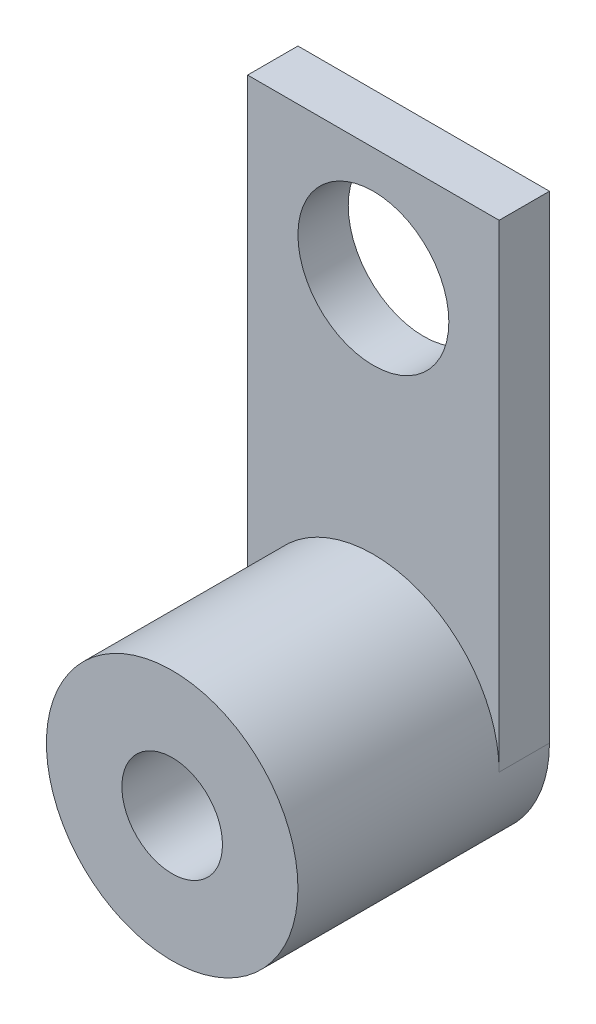
ISO-10303-21;
HEADER;
FILE_DESCRIPTION(('STEP AP214'),'2;1');
FILE_NAME('part.step','',(''),(''),'','','');
FILE_SCHEMA(('AUTOMOTIVE_DESIGN { 1 0 10303 214 1 1 1 1 }'));
ENDSEC;
DATA;
#1=APPLICATION_CONTEXT('core data for automotive mechanical design processes');
#2=APPLICATION_PROTOCOL_DEFINITION('international standard','automotive_design',2000,#1);
#3=PRODUCT_CONTEXT('',#1,'mechanical');
#4=PRODUCT('Part','Part','',(#3));
#5=PRODUCT_RELATED_PRODUCT_CATEGORY('part','',(#4));
#6=PRODUCT_DEFINITION_FORMATION('','',#4);
#7=PRODUCT_DEFINITION_CONTEXT('part definition',#1,'design');
#8=PRODUCT_DEFINITION('design','',#6,#7);
#9=PRODUCT_DEFINITION_SHAPE('','',#8);
#10=(LENGTH_UNIT() NAMED_UNIT(*) SI_UNIT(.MILLI.,.METRE.));
#11=(NAMED_UNIT(*) PLANE_ANGLE_UNIT() SI_UNIT($,.RADIAN.));
#12=(NAMED_UNIT(*) SI_UNIT($,.STERADIAN.) SOLID_ANGLE_UNIT());
#13=UNCERTAINTY_MEASURE_WITH_UNIT(LENGTH_MEASURE(1.E-05),#10,'distance_accuracy_value','');
#14=(GEOMETRIC_REPRESENTATION_CONTEXT(3) GLOBAL_UNCERTAINTY_ASSIGNED_CONTEXT((#13)) GLOBAL_UNIT_ASSIGNED_CONTEXT((#10,
#11,#12)) REPRESENTATION_CONTEXT('',''));
#15=CARTESIAN_POINT('',(0.,0.,0.));
#16=DIRECTION('',(0.,0.,1.));
#17=DIRECTION('',(1.,0.,0.));
#18=AXIS2_PLACEMENT_3D('',#15,#16,#17);
#19=CARTESIAN_POINT('',(0.,0.,127.));
#20=DIRECTION('',(0.,0.,1.));
#21=DIRECTION('',(1.,0.,0.));
#22=AXIS2_PLACEMENT_3D('',#19,#20,#21);
#23=PLANE('',#22);
#24=CARTESIAN_POINT('',(0.,0.,127.));
#25=DIRECTION('',(0.,0.,1.));
#26=DIRECTION('',(1.,0.,0.));
#27=AXIS2_PLACEMENT_3D('',#24,#25,#26);
#28=CIRCLE('',#27,63.5);
#29=CARTESIAN_POINT('',(63.5,0.,127.));
#30=VERTEX_POINT('',#29);
#31=EDGE_CURVE('E11',#30,#30,#28,.T.);
#32=ORIENTED_EDGE('',*,*,#31,.T.);
#33=EDGE_LOOP('',(#32));
#34=FACE_BOUND('',#33,.T.);
#35=CARTESIAN_POINT('',(0.,0.,127.));
#36=DIRECTION('',(0.,0.,1.));
#37=DIRECTION('',(1.,0.,0.));
#38=AXIS2_PLACEMENT_3D('',#35,#36,#37);
#39=CIRCLE('',#38,25.4);
#40=CARTESIAN_POINT('',(25.4,0.,127.));
#41=VERTEX_POINT('',#40);
#42=EDGE_CURVE('E134',#41,#41,#39,.T.);
#43=ORIENTED_EDGE('',*,*,#42,.F.);
#44=EDGE_LOOP('',(#43));
#45=FACE_BOUND('',#44,.T.);
#46=ADVANCED_FACE('F45',(#34,#45),#23,.T.);
#47=CARTESIAN_POINT('',(0.,0.,0.));
#48=DIRECTION('',(0.,0.,1.));
#49=DIRECTION('',(1.,0.,0.));
#50=AXIS2_PLACEMENT_3D('',#47,#48,#49);
#51=PLANE('',#50);
#52=CARTESIAN_POINT('',(0.,0.,0.));
#53=DIRECTION('',(0.,0.,1.));
#54=DIRECTION('',(1.,0.,0.));
#55=AXIS2_PLACEMENT_3D('',#52,#53,#54);
#56=CIRCLE('',#55,63.5);
#57=CARTESIAN_POINT('',(-63.5,0.,0.));
#58=VERTEX_POINT('',#57);
#59=CARTESIAN_POINT('',(63.5,0.,0.));
#60=VERTEX_POINT('',#59);
#61=EDGE_CURVE('E49',#58,#60,#56,.T.);
#62=ORIENTED_EDGE('',*,*,#61,.F.);
#63=DIRECTION('',(0.,-1.,0.));
#64=VECTOR('',#63,1.);
#65=CARTESIAN_POINT('',(-63.5,0.,0.));
#66=LINE('',#65,#64);
#67=CARTESIAN_POINT('',(-63.4999999999999,241.3,0.));
#68=VERTEX_POINT('',#67);
#69=EDGE_CURVE('E61',#68,#58,#66,.T.);
#70=ORIENTED_EDGE('',*,*,#69,.F.);
#71=DIRECTION('',(-1.,0.,0.));
#72=VECTOR('',#71,1.);
#73=CARTESIAN_POINT('',(-63.4999999999999,241.3,0.));
#74=LINE('',#73,#72);
#75=CARTESIAN_POINT('',(63.4999999999999,241.3,0.));
#76=VERTEX_POINT('',#75);
#77=EDGE_CURVE('E87',#76,#68,#74,.T.);
#78=ORIENTED_EDGE('',*,*,#77,.F.);
#79=DIRECTION('',(0.,1.,0.));
#80=VECTOR('',#79,1.);
#81=CARTESIAN_POINT('',(63.5,0.,0.));
#82=LINE('',#81,#80);
#83=EDGE_CURVE('E105',#60,#76,#82,.T.);
#84=ORIENTED_EDGE('',*,*,#83,.F.);
#85=EDGE_LOOP('',(#62,#70,#78,#84));
#86=FACE_BOUND('',#85,.T.);
#87=CARTESIAN_POINT('',(0.,0.,0.));
#88=DIRECTION('',(0.,0.,1.));
#89=DIRECTION('',(1.,0.,0.));
#90=AXIS2_PLACEMENT_3D('',#87,#88,#89);
#91=CIRCLE('',#90,25.4);
#92=CARTESIAN_POINT('',(25.4,0.,0.));
#93=VERTEX_POINT('',#92);
#94=EDGE_CURVE('E133',#93,#93,#91,.T.);
#95=ORIENTED_EDGE('',*,*,#94,.T.);
#96=EDGE_LOOP('',(#95));
#97=FACE_BOUND('',#96,.T.);
#98=CARTESIAN_POINT('',(0.,184.15,0.));
#99=DIRECTION('',(0.,0.,1.));
#100=DIRECTION('',(1.,0.,0.));
#101=AXIS2_PLACEMENT_3D('',#98,#99,#100);
#102=CIRCLE('',#101,38.1);
#103=CARTESIAN_POINT('',(38.1,184.15,0.));
#104=VERTEX_POINT('',#103);
#105=EDGE_CURVE('E239',#104,#104,#102,.T.);
#106=ORIENTED_EDGE('',*,*,#105,.T.);
#107=EDGE_LOOP('',(#106));
#108=FACE_BOUND('',#107,.T.);
#109=ADVANCED_FACE('F142',(#86,#97,#108),#51,.F.);
#110=CARTESIAN_POINT('',(0.,0.,127.));
#111=DIRECTION('',(0.,0.,-1.));
#112=DIRECTION('',(-1.,0.,0.));
#113=AXIS2_PLACEMENT_3D('',#110,#111,#112);
#114=CYLINDRICAL_SURFACE('',#113,63.5);
#115=ORIENTED_EDGE('',*,*,#31,.F.);
#116=EDGE_LOOP('',(#115));
#117=FACE_BOUND('',#116,.T.);
#118=CARTESIAN_POINT('',(0.,0.,25.4));
#119=DIRECTION('',(0.,0.,1.));
#120=DIRECTION('',(1.,0.,0.));
#121=AXIS2_PLACEMENT_3D('',#118,#119,#120);
#122=CIRCLE('',#121,63.5);
#123=CARTESIAN_POINT('',(63.5,0.,25.4));
#124=VERTEX_POINT('',#123);
#125=CARTESIAN_POINT('',(-63.5,0.,25.4));
#126=VERTEX_POINT('',#125);
#127=EDGE_CURVE('E91',#124,#126,#122,.T.);
#128=ORIENTED_EDGE('',*,*,#127,.T.);
#129=DIRECTION('',(0.,0.,-1.));
#130=VECTOR('',#129,1.);
#131=CARTESIAN_POINT('',(-63.5,0.,25.4));
#132=LINE('',#131,#130);
#133=EDGE_CURVE('E114',#126,#58,#132,.T.);
#134=ORIENTED_EDGE('',*,*,#133,.T.);
#135=ORIENTED_EDGE('',*,*,#61,.T.);
#136=DIRECTION('',(0.,0.,-1.));
#137=VECTOR('',#136,1.);
#138=CARTESIAN_POINT('',(63.5,0.,25.4));
#139=LINE('',#138,#137);
#140=EDGE_CURVE('E107',#124,#60,#139,.T.);
#141=ORIENTED_EDGE('',*,*,#140,.F.);
#142=EDGE_LOOP('',(#128,#134,#135,#141));
#143=FACE_BOUND('',#142,.T.);
#144=ADVANCED_FACE('F47',(#117,#143),#114,.T.);
#145=CARTESIAN_POINT('',(0.,0.,127.));
#146=DIRECTION('',(0.,0.,-1.));
#147=DIRECTION('',(-1.,0.,0.));
#148=AXIS2_PLACEMENT_3D('',#145,#146,#147);
#149=CYLINDRICAL_SURFACE('',#148,25.4);
#150=ORIENTED_EDGE('',*,*,#42,.T.);
#151=EDGE_LOOP('',(#150));
#152=FACE_BOUND('',#151,.T.);
#153=ORIENTED_EDGE('',*,*,#94,.F.);
#154=EDGE_LOOP('',(#153));
#155=FACE_BOUND('',#154,.T.);
#156=ADVANCED_FACE('F145',(#152,#155),#149,.F.);
#157=CARTESIAN_POINT('',(0.,0.,25.4));
#158=DIRECTION('',(0.,0.,1.));
#159=DIRECTION('',(1.,0.,0.));
#160=AXIS2_PLACEMENT_3D('',#157,#158,#159);
#161=PLANE('',#160);
#162=CARTESIAN_POINT('',(0.,184.15,25.4));
#163=DIRECTION('',(0.,0.,1.));
#164=DIRECTION('',(1.,0.,0.));
#165=AXIS2_PLACEMENT_3D('',#162,#163,#164);
#166=CIRCLE('',#165,38.1);
#167=CARTESIAN_POINT('',(38.1,184.15,25.4));
#168=VERTEX_POINT('',#167);
#169=EDGE_CURVE('E120',#168,#168,#166,.T.);
#170=ORIENTED_EDGE('',*,*,#169,.F.);
#171=EDGE_LOOP('',(#170));
#172=FACE_BOUND('',#171,.T.);
#173=ORIENTED_EDGE('',*,*,#127,.F.);
#174=DIRECTION('',(0.,1.,0.));
#175=VECTOR('',#174,1.);
#176=CARTESIAN_POINT('',(63.5,0.,25.4));
#177=LINE('',#176,#175);
#178=CARTESIAN_POINT('',(63.4999999999999,241.3,25.4));
#179=VERTEX_POINT('',#178);
#180=EDGE_CURVE('E93',#124,#179,#177,.T.);
#181=ORIENTED_EDGE('',*,*,#180,.T.);
#182=DIRECTION('',(-1.,0.,0.));
#183=VECTOR('',#182,1.);
#184=CARTESIAN_POINT('',(-63.4999999999999,241.3,25.4));
#185=LINE('',#184,#183);
#186=CARTESIAN_POINT('',(-63.4999999999999,241.3,25.4));
#187=VERTEX_POINT('',#186);
#188=EDGE_CURVE('E97',#179,#187,#185,.T.);
#189=ORIENTED_EDGE('',*,*,#188,.T.);
#190=DIRECTION('',(0.,-1.,0.));
#191=VECTOR('',#190,1.);
#192=CARTESIAN_POINT('',(-63.5,0.,25.4));
#193=LINE('',#192,#191);
#194=EDGE_CURVE('E70',#187,#126,#193,.T.);
#195=ORIENTED_EDGE('',*,*,#194,.T.);
#196=EDGE_LOOP('',(#173,#181,#189,#195));
#197=FACE_BOUND('',#196,.T.);
#198=ADVANCED_FACE('F95',(#172,#197),#161,.T.);
#199=CARTESIAN_POINT('',(63.5,0.,25.4));
#200=DIRECTION('',(-1.,0.,0.));
#201=DIRECTION('',(0.,-1.,0.));
#202=AXIS2_PLACEMENT_3D('',#199,#200,#201);
#203=PLANE('',#202);
#204=ORIENTED_EDGE('',*,*,#83,.T.);
#205=DIRECTION('',(0.,0.,-1.));
#206=VECTOR('',#205,1.);
#207=CARTESIAN_POINT('',(63.4999999999999,241.3,25.4));
#208=LINE('',#207,#206);
#209=EDGE_CURVE('E103',#179,#76,#208,.T.);
#210=ORIENTED_EDGE('',*,*,#209,.F.);
#211=ORIENTED_EDGE('',*,*,#180,.F.);
#212=ORIENTED_EDGE('',*,*,#140,.T.);
#213=EDGE_LOOP('',(#204,#210,#211,#212));
#214=FACE_BOUND('',#213,.T.);
#215=ADVANCED_FACE('F104',(#214),#203,.F.);
#216=CARTESIAN_POINT('',(-63.4999999999999,241.3,25.4));
#217=DIRECTION('',(0.,-1.,0.));
#218=DIRECTION('',(0.,0.,-1.));
#219=AXIS2_PLACEMENT_3D('',#216,#217,#218);
#220=PLANE('',#219);
#221=ORIENTED_EDGE('',*,*,#77,.T.);
#222=DIRECTION('',(0.,0.,-1.));
#223=VECTOR('',#222,1.);
#224=CARTESIAN_POINT('',(-63.4999999999999,241.3,25.4));
#225=LINE('',#224,#223);
#226=EDGE_CURVE('E108',#187,#68,#225,.T.);
#227=ORIENTED_EDGE('',*,*,#226,.F.);
#228=ORIENTED_EDGE('',*,*,#188,.F.);
#229=ORIENTED_EDGE('',*,*,#209,.T.);
#230=EDGE_LOOP('',(#221,#227,#228,#229));
#231=FACE_BOUND('',#230,.T.);
#232=ADVANCED_FACE('F110',(#231),#220,.F.);
#233=CARTESIAN_POINT('',(-63.5,0.,25.4));
#234=DIRECTION('',(1.,0.,0.));
#235=DIRECTION('',(0.,1.,0.));
#236=AXIS2_PLACEMENT_3D('',#233,#234,#235);
#237=PLANE('',#236);
#238=ORIENTED_EDGE('',*,*,#69,.T.);
#239=ORIENTED_EDGE('',*,*,#133,.F.);
#240=ORIENTED_EDGE('',*,*,#194,.F.);
#241=ORIENTED_EDGE('',*,*,#226,.T.);
#242=EDGE_LOOP('',(#238,#239,#240,#241));
#243=FACE_BOUND('',#242,.T.);
#244=ADVANCED_FACE('F171',(#243),#237,.F.);
#245=CARTESIAN_POINT('',(0.,184.15,25.4));
#246=DIRECTION('',(0.,0.,-1.));
#247=DIRECTION('',(-1.,0.,0.));
#248=AXIS2_PLACEMENT_3D('',#245,#246,#247);
#249=CYLINDRICAL_SURFACE('',#248,38.1);
#250=ORIENTED_EDGE('',*,*,#169,.T.);
#251=EDGE_LOOP('',(#250));
#252=FACE_BOUND('',#251,.T.);
#253=ORIENTED_EDGE('',*,*,#105,.F.);
#254=EDGE_LOOP('',(#253));
#255=FACE_BOUND('',#254,.T.);
#256=ADVANCED_FACE('F173',(#252,#255),#249,.F.);
#257=CLOSED_SHELL('',(#46,#109,#144,#156,#198,#215,#232,#244,#256));
#258=MANIFOLD_SOLID_BREP('B2',#257);
#259=ADVANCED_BREP_SHAPE_REPRESENTATION('',(#18,#258),#14);
#260=SHAPE_DEFINITION_REPRESENTATION(#9,#259);
ENDSEC;
END-ISO-10303-21;
